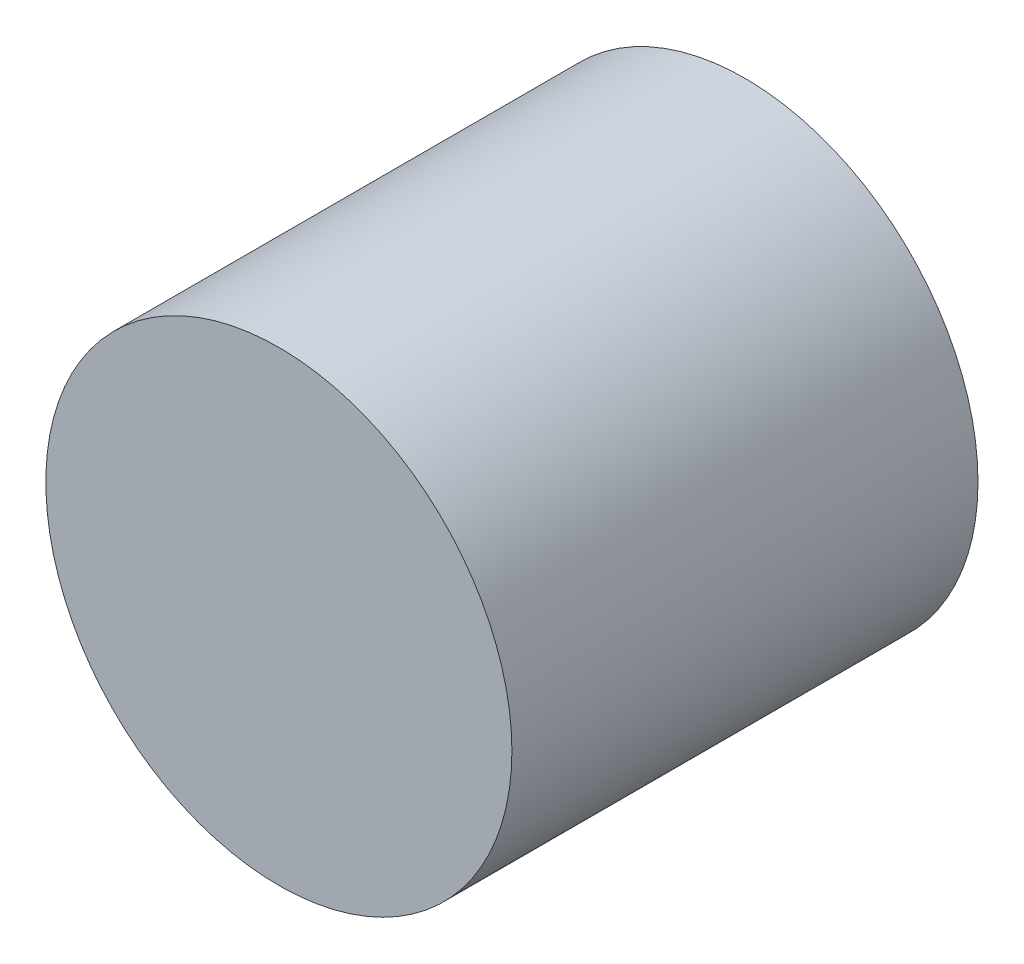
ISO-10303-21;
HEADER;
FILE_DESCRIPTION(('STEP AP214'),'2;1');
FILE_NAME('part.step','',(''),(''),'','','');
FILE_SCHEMA(('AUTOMOTIVE_DESIGN { 1 0 10303 214 1 1 1 1 }'));
ENDSEC;
DATA;
#1=APPLICATION_CONTEXT('core data for automotive mechanical design processes');
#2=APPLICATION_PROTOCOL_DEFINITION('international standard','automotive_design',2000,#1);
#3=PRODUCT_CONTEXT('',#1,'mechanical');
#4=PRODUCT('Part','Part','',(#3));
#5=PRODUCT_RELATED_PRODUCT_CATEGORY('part','',(#4));
#6=PRODUCT_DEFINITION_FORMATION('','',#4);
#7=PRODUCT_DEFINITION_CONTEXT('part definition',#1,'design');
#8=PRODUCT_DEFINITION('design','',#6,#7);
#9=PRODUCT_DEFINITION_SHAPE('','',#8);
#10=(LENGTH_UNIT() NAMED_UNIT(*) SI_UNIT(.MILLI.,.METRE.));
#11=(NAMED_UNIT(*) PLANE_ANGLE_UNIT() SI_UNIT($,.RADIAN.));
#12=(NAMED_UNIT(*) SI_UNIT($,.STERADIAN.) SOLID_ANGLE_UNIT());
#13=UNCERTAINTY_MEASURE_WITH_UNIT(LENGTH_MEASURE(1.E-05),#10,'distance_accuracy_value','');
#14=(GEOMETRIC_REPRESENTATION_CONTEXT(3) GLOBAL_UNCERTAINTY_ASSIGNED_CONTEXT((#13)) GLOBAL_UNIT_ASSIGNED_CONTEXT((#10,
#11,#12)) REPRESENTATION_CONTEXT('',''));
#15=CARTESIAN_POINT('',(0.,0.,0.));
#16=DIRECTION('',(0.,0.,1.));
#17=DIRECTION('',(1.,0.,0.));
#18=AXIS2_PLACEMENT_3D('',#15,#16,#17);
#19=CARTESIAN_POINT('',(0.,0.,6.));
#20=DIRECTION('',(0.,0.,-1.));
#21=DIRECTION('',(-1.,0.,0.));
#22=AXIS2_PLACEMENT_3D('',#19,#20,#21);
#23=CYLINDRICAL_SURFACE('',#22,6.);
#24=CARTESIAN_POINT('',(0.,0.,6.));
#25=DIRECTION('',(0.,0.,1.));
#26=DIRECTION('',(1.,0.,0.));
#27=AXIS2_PLACEMENT_3D('',#24,#25,#26);
#28=CIRCLE('',#27,6.);
#29=CARTESIAN_POINT('',(6.,0.,6.));
#30=VERTEX_POINT('',#29);
#31=EDGE_CURVE('E10',#30,#30,#28,.T.);
#32=ORIENTED_EDGE('',*,*,#31,.F.);
#33=EDGE_LOOP('',(#32));
#34=FACE_BOUND('',#33,.T.);
#35=CARTESIAN_POINT('',(0.,0.,-6.));
#36=DIRECTION('',(0.,0.,1.));
#37=DIRECTION('',(1.,0.,0.));
#38=AXIS2_PLACEMENT_3D('',#35,#36,#37);
#39=CIRCLE('',#38,6.);
#40=CARTESIAN_POINT('',(6.,0.,-6.));
#41=VERTEX_POINT('',#40);
#42=EDGE_CURVE('E40',#41,#41,#39,.T.);
#43=ORIENTED_EDGE('',*,*,#42,.T.);
#44=EDGE_LOOP('',(#43));
#45=FACE_BOUND('',#44,.T.);
#46=ADVANCED_FACE('F37',(#34,#45),#23,.T.);
#47=CARTESIAN_POINT('',(0.,0.,6.));
#48=DIRECTION('',(0.,0.,1.));
#49=DIRECTION('',(1.,0.,0.));
#50=AXIS2_PLACEMENT_3D('',#47,#48,#49);
#51=PLANE('',#50);
#52=ORIENTED_EDGE('',*,*,#31,.T.);
#53=EDGE_LOOP('',(#52));
#54=FACE_BOUND('',#53,.T.);
#55=ADVANCED_FACE('F52',(#54),#51,.T.);
#56=CARTESIAN_POINT('',(0.,0.,-6.));
#57=DIRECTION('',(0.,0.,1.));
#58=DIRECTION('',(1.,0.,0.));
#59=AXIS2_PLACEMENT_3D('',#56,#57,#58);
#60=PLANE('',#59);
#61=ORIENTED_EDGE('',*,*,#42,.F.);
#62=EDGE_LOOP('',(#61));
#63=FACE_BOUND('',#62,.T.);
#64=ADVANCED_FACE('F50',(#63),#60,.F.);
#65=CLOSED_SHELL('',(#46,#55,#64));
#66=MANIFOLD_SOLID_BREP('B2',#65);
#67=ADVANCED_BREP_SHAPE_REPRESENTATION('',(#18,#66),#14);
#68=SHAPE_DEFINITION_REPRESENTATION(#9,#67);
ENDSEC;
END-ISO-10303-21;
